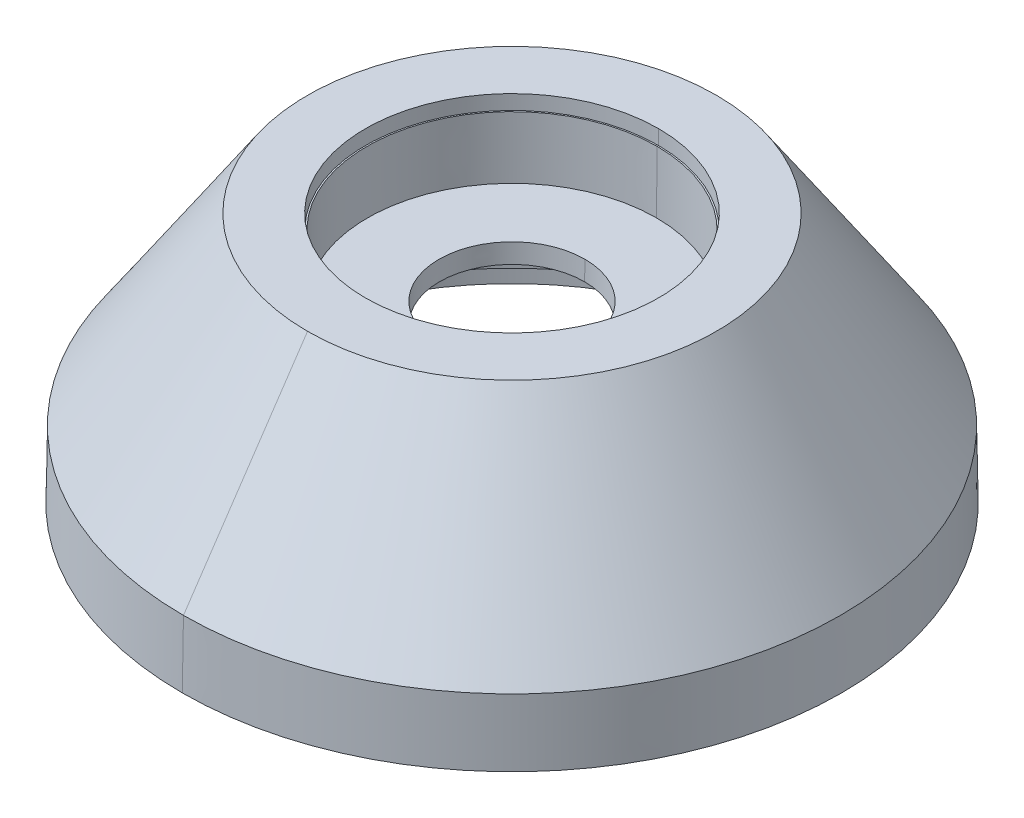
ISO-10303-21;
HEADER;
FILE_DESCRIPTION(('STEP AP214'),'2;1');
FILE_NAME('part.step','',(''),(''),'','','');
FILE_SCHEMA(('AUTOMOTIVE_DESIGN { 1 0 10303 214 1 1 1 1 }'));
ENDSEC;
DATA;
#1=APPLICATION_CONTEXT('core data for automotive mechanical design processes');
#2=APPLICATION_PROTOCOL_DEFINITION('international standard','automotive_design',2000,#1);
#3=PRODUCT_CONTEXT('',#1,'mechanical');
#4=PRODUCT('Part','Part','',(#3));
#5=PRODUCT_RELATED_PRODUCT_CATEGORY('part','',(#4));
#6=PRODUCT_DEFINITION_FORMATION('','',#4);
#7=PRODUCT_DEFINITION_CONTEXT('part definition',#1,'design');
#8=PRODUCT_DEFINITION('design','',#6,#7);
#9=PRODUCT_DEFINITION_SHAPE('','',#8);
#10=(LENGTH_UNIT() NAMED_UNIT(*) SI_UNIT(.MILLI.,.METRE.));
#11=(NAMED_UNIT(*) PLANE_ANGLE_UNIT() SI_UNIT($,.RADIAN.));
#12=(NAMED_UNIT(*) SI_UNIT($,.STERADIAN.) SOLID_ANGLE_UNIT());
#13=UNCERTAINTY_MEASURE_WITH_UNIT(LENGTH_MEASURE(1.E-05),#10,'distance_accuracy_value','');
#14=(GEOMETRIC_REPRESENTATION_CONTEXT(3) GLOBAL_UNCERTAINTY_ASSIGNED_CONTEXT((#13)) GLOBAL_UNIT_ASSIGNED_CONTEXT((#10,
#11,#12)) REPRESENTATION_CONTEXT('',''));
#15=CARTESIAN_POINT('',(0.,0.,0.));
#16=DIRECTION('',(0.,0.,1.));
#17=DIRECTION('',(1.,0.,0.));
#18=AXIS2_PLACEMENT_3D('',#15,#16,#17);
#19=CARTESIAN_POINT('',(0.,1.74698502317525,0.));
#20=DIRECTION('',(0.,-1.,0.));
#21=DIRECTION('',(0.,0.,-1.));
#22=AXIS2_PLACEMENT_3D('',#19,#20,#21);
#23=CONICAL_SURFACE('',#22,8.61820626299185,0.59341194567807);
#24=CARTESIAN_POINT('',(0.,6.57225,0.));
#25=DIRECTION('',(0.,1.,0.));
#26=DIRECTION('',(0.,0.,-1.));
#27=AXIS2_PLACEMENT_3D('',#24,#25,#26);
#28=CIRCLE('',#27,5.3635239401021);
#29=CARTESIAN_POINT('',(0.,6.57225,5.3635239401021));
#30=VERTEX_POINT('',#29);
#31=CARTESIAN_POINT('',(0.,6.57225,-5.3635239401021));
#32=VERTEX_POINT('',#31);
#33=EDGE_CURVE('E41',#30,#32,#28,.T.);
#34=ORIENTED_EDGE('',*,*,#33,.F.);
#35=DIRECTION('',(0.,-0.829037572555043,0.559192903470745));
#36=VECTOR('',#35,1.);
#37=CARTESIAN_POINT('',(0.,1.74698502317525,8.61820626299185));
#38=LINE('',#37,#36);
#39=CARTESIAN_POINT('',(0.,1.74698502317528,8.61820626299185));
#40=VERTEX_POINT('',#39);
#41=EDGE_CURVE('E11',#30,#40,#38,.T.);
#42=ORIENTED_EDGE('',*,*,#41,.T.);
#43=CARTESIAN_POINT('',(0.,1.74698502317528,0.));
#44=DIRECTION('',(0.,-1.,0.));
#45=DIRECTION('',(0.,0.,1.));
#46=AXIS2_PLACEMENT_3D('',#43,#44,#45);
#47=CIRCLE('',#46,8.61820626299185);
#48=CARTESIAN_POINT('',(0.,1.74698502317528,-8.61820626299185));
#49=VERTEX_POINT('',#48);
#50=EDGE_CURVE('E216',#49,#40,#47,.T.);
#51=ORIENTED_EDGE('',*,*,#50,.F.);
#52=DIRECTION('',(0.,-0.829037572555043,-0.559192903470745));
#53=VECTOR('',#52,1.);
#54=CARTESIAN_POINT('',(0.,1.74698502317525,-8.61820626299185));
#55=LINE('',#54,#53);
#56=EDGE_CURVE('E186',#32,#49,#55,.T.);
#57=ORIENTED_EDGE('',*,*,#56,.F.);
#58=EDGE_LOOP('',(#34,#42,#51,#57));
#59=FACE_BOUND('',#58,.T.);
#60=ADVANCED_FACE('F16',(#59),#23,.T.);
#61=CARTESIAN_POINT('',(0.,4.064,0.));
#62=DIRECTION('',(0.,1.,0.));
#63=DIRECTION('',(0.,0.,1.));
#64=AXIS2_PLACEMENT_3D('',#61,#62,#63);
#65=CONICAL_SURFACE('',#64,1.905,0.0174532925199352);
#66=CARTESIAN_POINT('',(0.,4.064,0.));
#67=DIRECTION('',(0.,-1.,0.));
#68=DIRECTION('',(0.,0.,-1.));
#69=AXIS2_PLACEMENT_3D('',#66,#67,#68);
#70=CIRCLE('',#69,1.905);
#71=CARTESIAN_POINT('',(0.,4.064,1.905));
#72=VERTEX_POINT('',#71);
#73=CARTESIAN_POINT('',(0.,4.064,-1.905));
#74=VERTEX_POINT('',#73);
#75=EDGE_CURVE('E27',#72,#74,#70,.T.);
#76=ORIENTED_EDGE('',*,*,#75,.T.);
#77=DIRECTION('',(0.,0.999847695156391,-0.017452406437277));
#78=VECTOR('',#77,1.);
#79=CARTESIAN_POINT('',(0.,4.064,-1.905));
#80=LINE('',#79,#78);
#81=CARTESIAN_POINT('',(0.,4.572,-1.91386717298353));
#82=VERTEX_POINT('',#81);
#83=EDGE_CURVE('E152',#74,#82,#80,.T.);
#84=ORIENTED_EDGE('',*,*,#83,.T.);
#85=CARTESIAN_POINT('',(0.,4.572,0.));
#86=DIRECTION('',(0.,-1.,0.));
#87=DIRECTION('',(0.,0.,-1.));
#88=AXIS2_PLACEMENT_3D('',#85,#86,#87);
#89=CIRCLE('',#88,1.91386717298353);
#90=CARTESIAN_POINT('',(0.,4.572,1.91386717298353));
#91=VERTEX_POINT('',#90);
#92=EDGE_CURVE('E185',#91,#82,#89,.T.);
#93=ORIENTED_EDGE('',*,*,#92,.F.);
#94=DIRECTION('',(0.,0.999847695156391,0.017452406437277));
#95=VECTOR('',#94,1.);
#96=CARTESIAN_POINT('',(0.,4.064,1.905));
#97=LINE('',#96,#95);
#98=EDGE_CURVE('E165',#72,#91,#97,.T.);
#99=ORIENTED_EDGE('',*,*,#98,.F.);
#100=EDGE_LOOP('',(#76,#84,#93,#99));
#101=FACE_BOUND('',#100,.T.);
#102=ADVANCED_FACE('F322',(#101),#65,.F.);
#103=CARTESIAN_POINT('',(0.,1.36291608715968,0.));
#104=DIRECTION('',(0.,-1.,0.));
#105=DIRECTION('',(0.,0.,-1.));
#106=AXIS2_PLACEMENT_3D('',#103,#104,#105);
#107=CONICAL_SURFACE('',#106,6.985,1.08210413623648);
#108=ORIENTED_EDGE('',*,*,#75,.F.);
#109=DIRECTION('',(0.,-0.469471562785892,0.882947592858926));
#110=VECTOR('',#109,1.);
#111=CARTESIAN_POINT('',(0.,1.36291608715968,6.985));
#112=LINE('',#111,#110);
#113=CARTESIAN_POINT('',(0.,1.36291608715968,6.985));
#114=VERTEX_POINT('',#113);
#115=EDGE_CURVE('E142',#72,#114,#112,.T.);
#116=ORIENTED_EDGE('',*,*,#115,.T.);
#117=CARTESIAN_POINT('',(0.,1.36291608715968,0.));
#118=DIRECTION('',(0.,-1.,0.));
#119=DIRECTION('',(0.,0.,-1.));
#120=AXIS2_PLACEMENT_3D('',#117,#118,#119);
#121=CIRCLE('',#120,6.985);
#122=CARTESIAN_POINT('',(0.,1.36291608715968,-6.985));
#123=VERTEX_POINT('',#122);
#124=EDGE_CURVE('E131',#114,#123,#121,.T.);
#125=ORIENTED_EDGE('',*,*,#124,.T.);
#126=DIRECTION('',(0.,-0.469471562785892,-0.882947592858926));
#127=VECTOR('',#126,1.);
#128=CARTESIAN_POINT('',(0.,1.36291608715968,-6.985));
#129=LINE('',#128,#127);
#130=EDGE_CURVE('E154',#74,#123,#129,.T.);
#131=ORIENTED_EDGE('',*,*,#130,.F.);
#132=EDGE_LOOP('',(#108,#116,#125,#131));
#133=FACE_BOUND('',#132,.T.);
#134=ADVANCED_FACE('F146',(#133),#107,.F.);
#135=CARTESIAN_POINT('',(0.,0.381,0.));
#136=DIRECTION('',(0.,-1.,0.));
#137=DIRECTION('',(0.,0.,-1.));
#138=AXIS2_PLACEMENT_3D('',#135,#136,#137);
#139=CONICAL_SURFACE('',#138,6.99356905187426,0.00872664625996925);
#140=ORIENTED_EDGE('',*,*,#124,.F.);
#141=DIRECTION('',(0.,-0.999961923064171,0.00872653549837399));
#142=VECTOR('',#141,1.);
#143=CARTESIAN_POINT('',(0.,0.381,6.99356905187426));
#144=LINE('',#143,#142);
#145=CARTESIAN_POINT('',(0.,0.381,6.99356905187426));
#146=VERTEX_POINT('',#145);
#147=EDGE_CURVE('E120',#114,#146,#144,.T.);
#148=ORIENTED_EDGE('',*,*,#147,.T.);
#149=CARTESIAN_POINT('',(0.,0.381,0.));
#150=DIRECTION('',(0.,-1.,0.));
#151=DIRECTION('',(0.,0.,-1.));
#152=AXIS2_PLACEMENT_3D('',#149,#150,#151);
#153=CIRCLE('',#152,6.99356905187426);
#154=CARTESIAN_POINT('',(0.,0.381,-6.99356905187426));
#155=VERTEX_POINT('',#154);
#156=EDGE_CURVE('E132',#146,#155,#153,.T.);
#157=ORIENTED_EDGE('',*,*,#156,.T.);
#158=DIRECTION('',(0.,-0.999961923064171,-0.00872653549837399));
#159=VECTOR('',#158,1.);
#160=CARTESIAN_POINT('',(0.,0.381,-6.99356905187426));
#161=LINE('',#160,#159);
#162=EDGE_CURVE('E138',#123,#155,#161,.T.);
#163=ORIENTED_EDGE('',*,*,#162,.F.);
#164=EDGE_LOOP('',(#140,#148,#157,#163));
#165=FACE_BOUND('',#164,.T.);
#166=ADVANCED_FACE('F137',(#165),#139,.F.);
#167=CARTESIAN_POINT('',(0.,0.,0.));
#168=DIRECTION('',(0.,-1.,0.));
#169=DIRECTION('',(0.,0.,-1.));
#170=AXIS2_PLACEMENT_3D('',#167,#168,#169);
#171=CONICAL_SURFACE('',#170,7.03499543928904,0.00872664625996925);
#172=CARTESIAN_POINT('',(0.,0.381,0.));
#173=DIRECTION('',(0.,-1.,0.));
#174=DIRECTION('',(0.,0.,-1.));
#175=AXIS2_PLACEMENT_3D('',#172,#173,#174);
#176=CIRCLE('',#175,7.03167050266076);
#177=CARTESIAN_POINT('',(0.,0.381,7.03167050266076));
#178=VERTEX_POINT('',#177);
#179=CARTESIAN_POINT('',(0.,0.381,-7.03167050266076));
#180=VERTEX_POINT('',#179);
#181=EDGE_CURVE('E226',#178,#180,#176,.T.);
#182=ORIENTED_EDGE('',*,*,#181,.F.);
#183=DIRECTION('',(0.,-0.999961923064171,0.00872653549837404));
#184=VECTOR('',#183,1.);
#185=CARTESIAN_POINT('',(0.,0.,7.03499543928904));
#186=LINE('',#185,#184);
#187=CARTESIAN_POINT('',(0.,0.,7.03499543928904));
#188=VERTEX_POINT('',#187);
#189=EDGE_CURVE('E203',#178,#188,#186,.T.);
#190=ORIENTED_EDGE('',*,*,#189,.T.);
#191=CARTESIAN_POINT('',(0.,0.,0.));
#192=DIRECTION('',(0.,-1.,0.));
#193=DIRECTION('',(0.,0.,-1.));
#194=AXIS2_PLACEMENT_3D('',#191,#192,#193);
#195=CIRCLE('',#194,7.03499543928904);
#196=CARTESIAN_POINT('',(0.,0.,-7.03499543928904));
#197=VERTEX_POINT('',#196);
#198=EDGE_CURVE('E207',#188,#197,#195,.T.);
#199=ORIENTED_EDGE('',*,*,#198,.T.);
#200=DIRECTION('',(0.,-0.999961923064171,-0.00872653549837404));
#201=VECTOR('',#200,1.);
#202=CARTESIAN_POINT('',(0.,0.,-7.03499543928904));
#203=LINE('',#202,#201);
#204=EDGE_CURVE('E191',#180,#197,#203,.T.);
#205=ORIENTED_EDGE('',*,*,#204,.F.);
#206=EDGE_LOOP('',(#182,#190,#199,#205));
#207=FACE_BOUND('',#206,.T.);
#208=ADVANCED_FACE('F364',(#207),#171,.F.);
#209=CARTESIAN_POINT('',(0.,6.57225,0.));
#210=DIRECTION('',(0.,-1.,0.));
#211=DIRECTION('',(0.,0.,-1.));
#212=AXIS2_PLACEMENT_3D('',#209,#210,#211);
#213=CONICAL_SURFACE('',#212,8.53398094952552,0.0174532925199415);
#214=ORIENTED_EDGE('',*,*,#50,.T.);
#215=DIRECTION('',(0.,-0.999847695156391,0.0174524064372835));
#216=VECTOR('',#215,1.);
#217=CARTESIAN_POINT('',(0.,6.57225,8.53398094952552));
#218=LINE('',#217,#216);
#219=CARTESIAN_POINT('',(0.,0.,8.6487));
#220=VERTEX_POINT('',#219);
#221=EDGE_CURVE('E222',#40,#220,#218,.T.);
#222=ORIENTED_EDGE('',*,*,#221,.T.);
#223=CARTESIAN_POINT('',(0.,0.,0.));
#224=DIRECTION('',(0.,-1.,0.));
#225=DIRECTION('',(0.,0.,-1.));
#226=AXIS2_PLACEMENT_3D('',#223,#224,#225);
#227=CIRCLE('',#226,8.6487);
#228=CARTESIAN_POINT('',(0.,0.,-8.6487));
#229=VERTEX_POINT('',#228);
#230=EDGE_CURVE('E212',#229,#220,#227,.T.);
#231=ORIENTED_EDGE('',*,*,#230,.F.);
#232=DIRECTION('',(0.,-0.999847695156391,-0.0174524064372835));
#233=VECTOR('',#232,1.);
#234=CARTESIAN_POINT('',(0.,6.57225,-8.53398094952552));
#235=LINE('',#234,#233);
#236=EDGE_CURVE('E232',#49,#229,#235,.T.);
#237=ORIENTED_EDGE('',*,*,#236,.F.);
#238=EDGE_LOOP('',(#214,#222,#231,#237));
#239=FACE_BOUND('',#238,.T.);
#240=ADVANCED_FACE('F408',(#239),#213,.T.);
#241=CARTESIAN_POINT('',(0.,6.19125,0.));
#242=DIRECTION('',(0.,1.,0.));
#243=DIRECTION('',(0.,0.,1.));
#244=AXIS2_PLACEMENT_3D('',#241,#242,#243);
#245=CONICAL_SURFACE('',#244,3.84318243145667,0.00872664625996925);
#246=CARTESIAN_POINT('',(0.,6.19125,0.));
#247=DIRECTION('',(0.,-1.,0.));
#248=DIRECTION('',(0.,0.,-1.));
#249=AXIS2_PLACEMENT_3D('',#246,#247,#248);
#250=CIRCLE('',#249,3.84318243145667);
#251=CARTESIAN_POINT('',(0.,6.19125,3.84318243145667));
#252=VERTEX_POINT('',#251);
#253=CARTESIAN_POINT('',(0.,6.19125,-3.84318243145667));
#254=VERTEX_POINT('',#253);
#255=EDGE_CURVE('E250',#252,#254,#250,.T.);
#256=ORIENTED_EDGE('',*,*,#255,.T.);
#257=DIRECTION('',(0.,0.999961923064171,-0.0087265354983672));
#258=VECTOR('',#257,1.);
#259=CARTESIAN_POINT('',(0.,6.19125,-3.84318243145667));
#260=LINE('',#259,#258);
#261=CARTESIAN_POINT('',(0.,6.57225,-3.84650736808495));
#262=VERTEX_POINT('',#261);
#263=EDGE_CURVE('E169',#254,#262,#260,.T.);
#264=ORIENTED_EDGE('',*,*,#263,.T.);
#265=CARTESIAN_POINT('',(0.,6.57225,0.));
#266=DIRECTION('',(0.,-1.,0.));
#267=DIRECTION('',(0.,0.,-1.));
#268=AXIS2_PLACEMENT_3D('',#265,#266,#267);
#269=CIRCLE('',#268,3.84650736808495);
#270=CARTESIAN_POINT('',(0.,6.57225,3.84650736808495));
#271=VERTEX_POINT('',#270);
#272=EDGE_CURVE('E20',#271,#262,#269,.T.);
#273=ORIENTED_EDGE('',*,*,#272,.F.);
#274=DIRECTION('',(0.,0.999961923064171,0.0087265354983672));
#275=VECTOR('',#274,1.);
#276=CARTESIAN_POINT('',(0.,6.19125,3.84318243145667));
#277=LINE('',#276,#275);
#278=EDGE_CURVE('E198',#252,#271,#277,.T.);
#279=ORIENTED_EDGE('',*,*,#278,.F.);
#280=EDGE_LOOP('',(#256,#264,#273,#279));
#281=FACE_BOUND('',#280,.T.);
#282=ADVANCED_FACE('F427',(#281),#245,.F.);
#283=CARTESIAN_POINT('',(0.,4.572,0.));
#284=DIRECTION('',(0.,1.,0.));
#285=DIRECTION('',(0.,0.,1.));
#286=AXIS2_PLACEMENT_3D('',#283,#284,#285);
#287=CONICAL_SURFACE('',#286,3.79095,0.00872664625996925);
#288=CARTESIAN_POINT('',(0.,4.572,0.));
#289=DIRECTION('',(0.,-1.,0.));
#290=DIRECTION('',(0.,0.,-1.));
#291=AXIS2_PLACEMENT_3D('',#288,#289,#290);
#292=CIRCLE('',#291,3.79095);
#293=CARTESIAN_POINT('',(0.,4.572,3.79095));
#294=VERTEX_POINT('',#293);
#295=CARTESIAN_POINT('',(0.,4.572,-3.79095));
#296=VERTEX_POINT('',#295);
#297=EDGE_CURVE('E277',#294,#296,#292,.T.);
#298=ORIENTED_EDGE('',*,*,#297,.T.);
#299=DIRECTION('',(0.,0.999961923064171,-0.00872653549836681));
#300=VECTOR('',#299,1.);
#301=CARTESIAN_POINT('',(0.,4.572,-3.79095));
#302=LINE('',#301,#300);
#303=CARTESIAN_POINT('',(0.,6.19125,-3.80508098067018));
#304=VERTEX_POINT('',#303);
#305=EDGE_CURVE('E248',#296,#304,#302,.T.);
#306=ORIENTED_EDGE('',*,*,#305,.T.);
#307=CARTESIAN_POINT('',(0.,6.19125,0.));
#308=DIRECTION('',(0.,-1.,0.));
#309=DIRECTION('',(0.,0.,-1.));
#310=AXIS2_PLACEMENT_3D('',#307,#308,#309);
#311=CIRCLE('',#310,3.80508098067018);
#312=CARTESIAN_POINT('',(0.,6.19125,3.80508098067018));
#313=VERTEX_POINT('',#312);
#314=EDGE_CURVE('E174',#313,#304,#311,.T.);
#315=ORIENTED_EDGE('',*,*,#314,.F.);
#316=DIRECTION('',(0.,0.999961923064171,0.00872653549836681));
#317=VECTOR('',#316,1.);
#318=CARTESIAN_POINT('',(0.,4.572,3.79095));
#319=LINE('',#318,#317);
#320=EDGE_CURVE('E176',#294,#313,#319,.T.);
#321=ORIENTED_EDGE('',*,*,#320,.F.);
#322=EDGE_LOOP('',(#298,#306,#315,#321));
#323=FACE_BOUND('',#322,.T.);
#324=ADVANCED_FACE('F288',(#323),#287,.F.);
#325=CARTESIAN_POINT('',(0.,4.572,0.));
#326=DIRECTION('',(0.,1.,0.));
#327=DIRECTION('',(0.,0.,1.));
#328=AXIS2_PLACEMENT_3D('',#325,#326,#327);
#329=CONICAL_SURFACE('',#328,3.79095,0.00872664625996925);
#330=ORIENTED_EDGE('',*,*,#305,.F.);
#331=CARTESIAN_POINT('',(0.,4.572,0.));
#332=DIRECTION('',(0.,-1.,0.));
#333=DIRECTION('',(0.,0.,-1.));
#334=AXIS2_PLACEMENT_3D('',#331,#332,#333);
#335=CIRCLE('',#334,3.79095);
#336=EDGE_CURVE('E180',#296,#294,#335,.T.);
#337=ORIENTED_EDGE('',*,*,#336,.T.);
#338=ORIENTED_EDGE('',*,*,#320,.T.);
#339=CARTESIAN_POINT('',(0.,6.19125,0.));
#340=DIRECTION('',(0.,-1.,0.));
#341=DIRECTION('',(0.,0.,-1.));
#342=AXIS2_PLACEMENT_3D('',#339,#340,#341);
#343=CIRCLE('',#342,3.80508098067018);
#344=EDGE_CURVE('E171',#304,#313,#343,.T.);
#345=ORIENTED_EDGE('',*,*,#344,.F.);
#346=EDGE_LOOP('',(#330,#337,#338,#345));
#347=FACE_BOUND('',#346,.T.);
#348=ADVANCED_FACE('F293',(#347),#329,.F.);
#349=CARTESIAN_POINT('',(0.,6.19125,3.84318243145667));
#350=DIRECTION('',(0.,-1.,0.));
#351=DIRECTION('',(0.,0.,-1.));
#352=AXIS2_PLACEMENT_3D('',#349,#350,#351);
#353=PLANE('',#352);
#354=ORIENTED_EDGE('',*,*,#255,.F.);
#355=CARTESIAN_POINT('',(0.,6.19125,0.));
#356=DIRECTION('',(0.,-1.,0.));
#357=DIRECTION('',(0.,0.,-1.));
#358=AXIS2_PLACEMENT_3D('',#355,#356,#357);
#359=CIRCLE('',#358,3.84318243145667);
#360=EDGE_CURVE('E175',#254,#252,#359,.T.);
#361=ORIENTED_EDGE('',*,*,#360,.F.);
#362=EDGE_LOOP('',(#354,#361));
#363=FACE_BOUND('',#362,.T.);
#364=ORIENTED_EDGE('',*,*,#314,.T.);
#365=ORIENTED_EDGE('',*,*,#344,.T.);
#366=EDGE_LOOP('',(#364,#365));
#367=FACE_BOUND('',#366,.T.);
#368=ADVANCED_FACE('F295',(#363,#367),#353,.F.);
#369=CARTESIAN_POINT('',(0.,6.19125,0.));
#370=DIRECTION('',(0.,1.,0.));
#371=DIRECTION('',(0.,0.,1.));
#372=AXIS2_PLACEMENT_3D('',#369,#370,#371);
#373=CONICAL_SURFACE('',#372,3.84318243145667,0.00872664625996925);
#374=ORIENTED_EDGE('',*,*,#263,.F.);
#375=ORIENTED_EDGE('',*,*,#360,.T.);
#376=ORIENTED_EDGE('',*,*,#278,.T.);
#377=CARTESIAN_POINT('',(0.,6.57225,0.));
#378=DIRECTION('',(0.,-1.,0.));
#379=DIRECTION('',(0.,0.,-1.));
#380=AXIS2_PLACEMENT_3D('',#377,#378,#379);
#381=CIRCLE('',#380,3.84650736808495);
#382=EDGE_CURVE('E243',#262,#271,#381,.T.);
#383=ORIENTED_EDGE('',*,*,#382,.F.);
#384=EDGE_LOOP('',(#374,#375,#376,#383));
#385=FACE_BOUND('',#384,.T.);
#386=ADVANCED_FACE('F378',(#385),#373,.F.);
#387=CARTESIAN_POINT('',(0.,6.57225,8.53398094952552));
#388=DIRECTION('',(0.,-1.,0.));
#389=DIRECTION('',(0.,0.,-1.));
#390=AXIS2_PLACEMENT_3D('',#387,#388,#389);
#391=PLANE('',#390);
#392=CARTESIAN_POINT('',(0.,6.57225,0.));
#393=DIRECTION('',(0.,1.,0.));
#394=DIRECTION('',(0.,0.,-1.));
#395=AXIS2_PLACEMENT_3D('',#392,#393,#394);
#396=CIRCLE('',#395,5.3635239401021);
#397=EDGE_CURVE('E202',#32,#30,#396,.T.);
#398=ORIENTED_EDGE('',*,*,#397,.T.);
#399=ORIENTED_EDGE('',*,*,#33,.T.);
#400=EDGE_LOOP('',(#398,#399));
#401=FACE_BOUND('',#400,.T.);
#402=ORIENTED_EDGE('',*,*,#272,.T.);
#403=ORIENTED_EDGE('',*,*,#382,.T.);
#404=EDGE_LOOP('',(#402,#403));
#405=FACE_BOUND('',#404,.T.);
#406=ADVANCED_FACE('F373',(#401,#405),#391,.F.);
#407=CARTESIAN_POINT('',(0.,6.57225,0.));
#408=DIRECTION('',(0.,-1.,0.));
#409=DIRECTION('',(0.,0.,-1.));
#410=AXIS2_PLACEMENT_3D('',#407,#408,#409);
#411=CONICAL_SURFACE('',#410,8.53398094952552,0.0174532925199415);
#412=ORIENTED_EDGE('',*,*,#221,.F.);
#413=CARTESIAN_POINT('',(0.,1.74698502317528,0.));
#414=DIRECTION('',(0.,-1.,0.));
#415=DIRECTION('',(0.,0.,1.));
#416=AXIS2_PLACEMENT_3D('',#413,#414,#415);
#417=CIRCLE('',#416,8.61820626299185);
#418=EDGE_CURVE('E236',#40,#49,#417,.T.);
#419=ORIENTED_EDGE('',*,*,#418,.T.);
#420=ORIENTED_EDGE('',*,*,#236,.T.);
#421=CARTESIAN_POINT('',(0.,0.,0.));
#422=DIRECTION('',(0.,-1.,0.));
#423=DIRECTION('',(0.,0.,-1.));
#424=AXIS2_PLACEMENT_3D('',#421,#422,#423);
#425=CIRCLE('',#424,8.6487);
#426=EDGE_CURVE('E208',#220,#229,#425,.T.);
#427=ORIENTED_EDGE('',*,*,#426,.F.);
#428=EDGE_LOOP('',(#412,#419,#420,#427));
#429=FACE_BOUND('',#428,.T.);
#430=ADVANCED_FACE('F367',(#429),#411,.T.);
#431=CARTESIAN_POINT('',(0.,0.,7.03499543928904));
#432=DIRECTION('',(0.,1.,0.));
#433=DIRECTION('',(1.,0.,0.));
#434=AXIS2_PLACEMENT_3D('',#431,#432,#433);
#435=PLANE('',#434);
#436=ORIENTED_EDGE('',*,*,#230,.T.);
#437=ORIENTED_EDGE('',*,*,#426,.T.);
#438=EDGE_LOOP('',(#436,#437));
#439=FACE_BOUND('',#438,.T.);
#440=CARTESIAN_POINT('',(0.,0.,0.));
#441=DIRECTION('',(0.,-1.,0.));
#442=DIRECTION('',(0.,0.,-1.));
#443=AXIS2_PLACEMENT_3D('',#440,#441,#442);
#444=CIRCLE('',#443,7.03499543928904);
#445=EDGE_CURVE('E187',#197,#188,#444,.T.);
#446=ORIENTED_EDGE('',*,*,#445,.F.);
#447=ORIENTED_EDGE('',*,*,#198,.F.);
#448=EDGE_LOOP('',(#446,#447));
#449=FACE_BOUND('',#448,.T.);
#450=ADVANCED_FACE('F355',(#439,#449),#435,.F.);
#451=CARTESIAN_POINT('',(0.,0.,0.));
#452=DIRECTION('',(0.,-1.,0.));
#453=DIRECTION('',(0.,0.,-1.));
#454=AXIS2_PLACEMENT_3D('',#451,#452,#453);
#455=CONICAL_SURFACE('',#454,7.03499543928904,0.00872664625996925);
#456=ORIENTED_EDGE('',*,*,#189,.F.);
#457=CARTESIAN_POINT('',(0.,0.381,0.));
#458=DIRECTION('',(0.,-1.,0.));
#459=DIRECTION('',(0.,0.,-1.));
#460=AXIS2_PLACEMENT_3D('',#457,#458,#459);
#461=CIRCLE('',#460,7.03167050266076);
#462=EDGE_CURVE('E192',#180,#178,#461,.T.);
#463=ORIENTED_EDGE('',*,*,#462,.F.);
#464=ORIENTED_EDGE('',*,*,#204,.T.);
#465=ORIENTED_EDGE('',*,*,#445,.T.);
#466=EDGE_LOOP('',(#456,#463,#464,#465));
#467=FACE_BOUND('',#466,.T.);
#468=ADVANCED_FACE('F349',(#467),#455,.F.);
#469=CARTESIAN_POINT('',(0.,0.381,6.99356905187426));
#470=DIRECTION('',(0.,1.,0.));
#471=DIRECTION('',(1.,0.,0.));
#472=AXIS2_PLACEMENT_3D('',#469,#470,#471);
#473=PLANE('',#472);
#474=ORIENTED_EDGE('',*,*,#462,.T.);
#475=ORIENTED_EDGE('',*,*,#181,.T.);
#476=EDGE_LOOP('',(#474,#475));
#477=FACE_BOUND('',#476,.T.);
#478=CARTESIAN_POINT('',(0.,0.381,0.));
#479=DIRECTION('',(0.,-1.,0.));
#480=DIRECTION('',(0.,0.,-1.));
#481=AXIS2_PLACEMENT_3D('',#478,#479,#480);
#482=CIRCLE('',#481,6.99356905187426);
#483=EDGE_CURVE('E127',#155,#146,#482,.T.);
#484=ORIENTED_EDGE('',*,*,#483,.F.);
#485=ORIENTED_EDGE('',*,*,#156,.F.);
#486=EDGE_LOOP('',(#484,#485));
#487=FACE_BOUND('',#486,.T.);
#488=ADVANCED_FACE('F347',(#477,#487),#473,.F.);
#489=CARTESIAN_POINT('',(0.,0.381,0.));
#490=DIRECTION('',(0.,-1.,0.));
#491=DIRECTION('',(0.,0.,-1.));
#492=AXIS2_PLACEMENT_3D('',#489,#490,#491);
#493=CONICAL_SURFACE('',#492,6.99356905187426,0.00872664625996925);
#494=ORIENTED_EDGE('',*,*,#147,.F.);
#495=CARTESIAN_POINT('',(0.,1.36291608715968,0.));
#496=DIRECTION('',(0.,-1.,0.));
#497=DIRECTION('',(0.,0.,-1.));
#498=AXIS2_PLACEMENT_3D('',#495,#496,#497);
#499=CIRCLE('',#498,6.985);
#500=EDGE_CURVE('E125',#123,#114,#499,.T.);
#501=ORIENTED_EDGE('',*,*,#500,.F.);
#502=ORIENTED_EDGE('',*,*,#162,.T.);
#503=ORIENTED_EDGE('',*,*,#483,.T.);
#504=EDGE_LOOP('',(#494,#501,#502,#503));
#505=FACE_BOUND('',#504,.T.);
#506=ADVANCED_FACE('F122',(#505),#493,.F.);
#507=CARTESIAN_POINT('',(0.,1.36291608715968,0.));
#508=DIRECTION('',(0.,-1.,0.));
#509=DIRECTION('',(0.,0.,-1.));
#510=AXIS2_PLACEMENT_3D('',#507,#508,#509);
#511=CONICAL_SURFACE('',#510,6.985,1.08210413623648);
#512=ORIENTED_EDGE('',*,*,#115,.F.);
#513=CARTESIAN_POINT('',(0.,4.064,0.));
#514=DIRECTION('',(0.,-1.,0.));
#515=DIRECTION('',(0.,0.,-1.));
#516=AXIS2_PLACEMENT_3D('',#513,#514,#515);
#517=CIRCLE('',#516,1.905);
#518=EDGE_CURVE('E156',#74,#72,#517,.T.);
#519=ORIENTED_EDGE('',*,*,#518,.F.);
#520=ORIENTED_EDGE('',*,*,#130,.T.);
#521=ORIENTED_EDGE('',*,*,#500,.T.);
#522=EDGE_LOOP('',(#512,#519,#520,#521));
#523=FACE_BOUND('',#522,.T.);
#524=ADVANCED_FACE('F18',(#523),#511,.F.);
#525=CARTESIAN_POINT('',(0.,4.064,0.));
#526=DIRECTION('',(0.,1.,0.));
#527=DIRECTION('',(0.,0.,1.));
#528=AXIS2_PLACEMENT_3D('',#525,#526,#527);
#529=CONICAL_SURFACE('',#528,1.905,0.0174532925199352);
#530=ORIENTED_EDGE('',*,*,#83,.F.);
#531=ORIENTED_EDGE('',*,*,#518,.T.);
#532=ORIENTED_EDGE('',*,*,#98,.T.);
#533=CARTESIAN_POINT('',(0.,4.572,0.));
#534=DIRECTION('',(0.,-1.,0.));
#535=DIRECTION('',(0.,0.,-1.));
#536=AXIS2_PLACEMENT_3D('',#533,#534,#535);
#537=CIRCLE('',#536,1.91386717298353);
#538=EDGE_CURVE('E181',#82,#91,#537,.T.);
#539=ORIENTED_EDGE('',*,*,#538,.F.);
#540=EDGE_LOOP('',(#530,#531,#532,#539));
#541=FACE_BOUND('',#540,.T.);
#542=ADVANCED_FACE('F324',(#541),#529,.F.);
#543=CARTESIAN_POINT('',(0.,4.572,3.79095));
#544=DIRECTION('',(0.,-1.,0.));
#545=DIRECTION('',(0.,0.,-1.));
#546=AXIS2_PLACEMENT_3D('',#543,#544,#545);
#547=PLANE('',#546);
#548=ORIENTED_EDGE('',*,*,#297,.F.);
#549=ORIENTED_EDGE('',*,*,#336,.F.);
#550=EDGE_LOOP('',(#548,#549));
#551=FACE_BOUND('',#550,.T.);
#552=ORIENTED_EDGE('',*,*,#92,.T.);
#553=ORIENTED_EDGE('',*,*,#538,.T.);
#554=EDGE_LOOP('',(#552,#553));
#555=FACE_BOUND('',#554,.T.);
#556=ADVANCED_FACE('F319',(#551,#555),#547,.F.);
#557=CARTESIAN_POINT('',(0.,1.74698502317525,0.));
#558=DIRECTION('',(0.,-1.,0.));
#559=DIRECTION('',(0.,0.,-1.));
#560=AXIS2_PLACEMENT_3D('',#557,#558,#559);
#561=CONICAL_SURFACE('',#560,8.61820626299185,0.59341194567807);
#562=ORIENTED_EDGE('',*,*,#41,.F.);
#563=ORIENTED_EDGE('',*,*,#397,.F.);
#564=ORIENTED_EDGE('',*,*,#56,.T.);
#565=ORIENTED_EDGE('',*,*,#418,.F.);
#566=EDGE_LOOP('',(#562,#563,#564,#565));
#567=FACE_BOUND('',#566,.T.);
#568=ADVANCED_FACE('F332',(#567),#561,.T.);
#569=CLOSED_SHELL('',(#60,#102,#134,#166,#208,#240,#282,#324,#348,#368,#386,#406,#430,#450,#468,
#488,#506,#524,#542,#556,#568));
#570=MANIFOLD_SOLID_BREP('B1',#569);
#571=ADVANCED_BREP_SHAPE_REPRESENTATION('',(#18,#570),#14);
#572=SHAPE_DEFINITION_REPRESENTATION(#9,#571);
ENDSEC;
END-ISO-10303-21;
